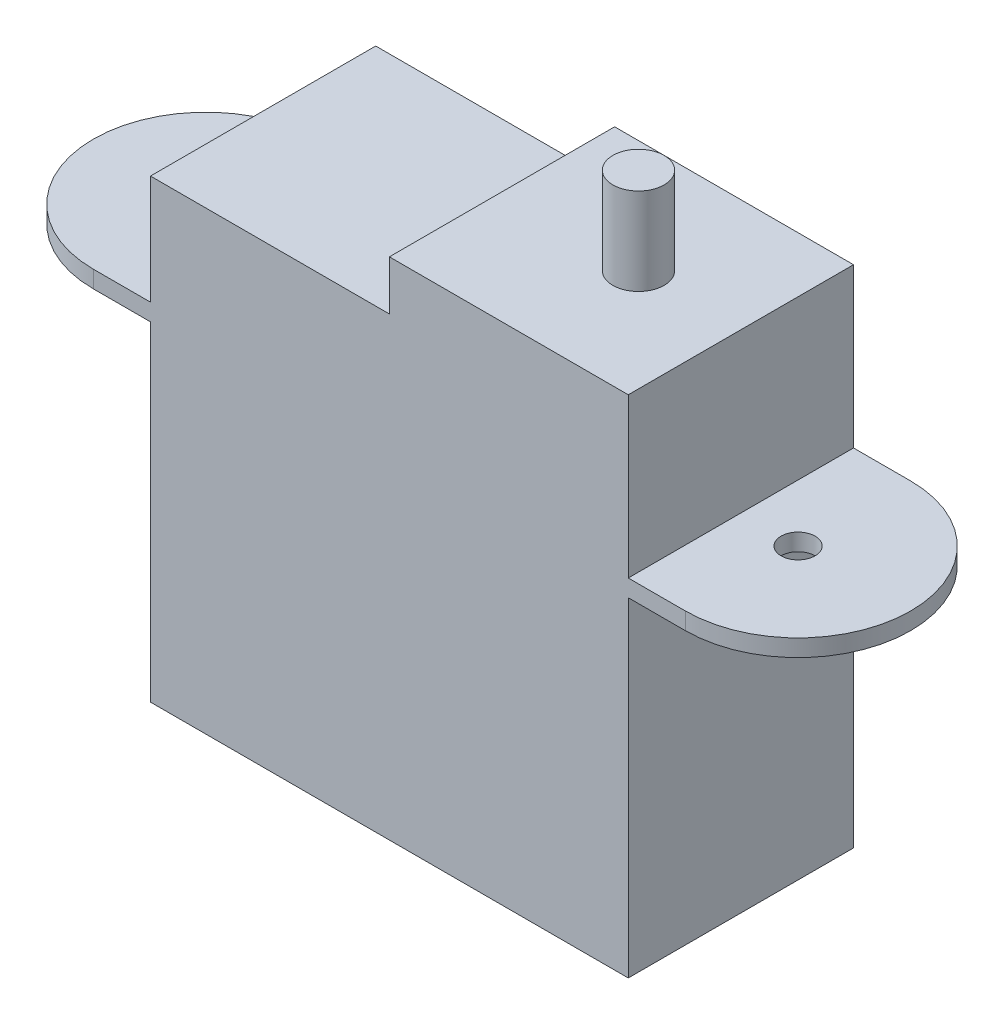
ISO-10303-21;
HEADER;
FILE_DESCRIPTION(('STEP AP214'),'2;1');
FILE_NAME('part.step','',(''),(''),'','','');
FILE_SCHEMA(('AUTOMOTIVE_DESIGN { 1 0 10303 214 1 1 1 1 }'));
ENDSEC;
DATA;
#1=APPLICATION_CONTEXT('core data for automotive mechanical design processes');
#2=APPLICATION_PROTOCOL_DEFINITION('international standard','automotive_design',2000,#1);
#3=PRODUCT_CONTEXT('',#1,'mechanical');
#4=PRODUCT('Part','Part','',(#3));
#5=PRODUCT_RELATED_PRODUCT_CATEGORY('part','',(#4));
#6=PRODUCT_DEFINITION_FORMATION('','',#4);
#7=PRODUCT_DEFINITION_CONTEXT('part definition',#1,'design');
#8=PRODUCT_DEFINITION('design','',#6,#7);
#9=PRODUCT_DEFINITION_SHAPE('','',#8);
#10=(LENGTH_UNIT() NAMED_UNIT(*) SI_UNIT(.MILLI.,.METRE.));
#11=(NAMED_UNIT(*) PLANE_ANGLE_UNIT() SI_UNIT($,.RADIAN.));
#12=(NAMED_UNIT(*) SI_UNIT($,.STERADIAN.) SOLID_ANGLE_UNIT());
#13=UNCERTAINTY_MEASURE_WITH_UNIT(LENGTH_MEASURE(1.E-05),#10,'distance_accuracy_value','');
#14=(GEOMETRIC_REPRESENTATION_CONTEXT(3) GLOBAL_UNCERTAINTY_ASSIGNED_CONTEXT((#13)) GLOBAL_UNIT_ASSIGNED_CONTEXT((#10,
#11,#12)) REPRESENTATION_CONTEXT('',''));
#15=CARTESIAN_POINT('',(0.,0.,0.));
#16=DIRECTION('',(0.,0.,1.));
#17=DIRECTION('',(1.,0.,0.));
#18=AXIS2_PLACEMENT_3D('',#15,#16,#17);
#19=CARTESIAN_POINT('',(-3.35,20.3,-6.6));
#20=DIRECTION('',(0.,1.,0.));
#21=DIRECTION('',(0.,0.,1.));
#22=AXIS2_PLACEMENT_3D('',#19,#20,#21);
#23=PLANE('',#22);
#24=CARTESIAN_POINT('',(-3.35,20.3,-6.6));
#25=DIRECTION('',(0.,1.,0.));
#26=DIRECTION('',(0.,0.,1.));
#27=AXIS2_PLACEMENT_3D('',#24,#25,#26);
#28=CIRCLE('',#27,1.);
#29=CARTESIAN_POINT('',(-3.35,20.3,-5.6));
#30=VERTEX_POINT('',#29);
#31=EDGE_CURVE('E231',#30,#30,#28,.T.);
#32=ORIENTED_EDGE('',*,*,#31,.F.);
#33=EDGE_LOOP('',(#32));
#34=FACE_BOUND('',#33,.T.);
#35=DIRECTION('',(0.,0.,1.));
#36=VECTOR('',#35,1.);
#37=CARTESIAN_POINT('',(0.,20.3,0.));
#38=LINE('',#37,#36);
#39=CARTESIAN_POINT('',(0.,20.3,-13.2));
#40=VERTEX_POINT('',#39);
#41=CARTESIAN_POINT('',(0.,20.3,0.));
#42=VERTEX_POINT('',#41);
#43=EDGE_CURVE('E155',#40,#42,#38,.T.);
#44=ORIENTED_EDGE('',*,*,#43,.F.);
#45=DIRECTION('',(-1.,0.,0.));
#46=VECTOR('',#45,1.);
#47=CARTESIAN_POINT('',(-3.35,20.3,-13.2));
#48=LINE('',#47,#46);
#49=CARTESIAN_POINT('',(-3.35,20.3,-13.2));
#50=VERTEX_POINT('',#49);
#51=EDGE_CURVE('E174',#40,#50,#48,.T.);
#52=ORIENTED_EDGE('',*,*,#51,.T.);
#53=CARTESIAN_POINT('',(-3.35,20.3,-6.6));
#54=DIRECTION('',(0.,1.,0.));
#55=DIRECTION('',(0.,0.,1.));
#56=AXIS2_PLACEMENT_3D('',#53,#54,#55);
#57=CIRCLE('',#56,6.6);
#58=CARTESIAN_POINT('',(-3.35,20.3,0.));
#59=VERTEX_POINT('',#58);
#60=EDGE_CURVE('E165',#50,#59,#57,.T.);
#61=ORIENTED_EDGE('',*,*,#60,.T.);
#62=DIRECTION('',(1.,0.,0.));
#63=VECTOR('',#62,1.);
#64=CARTESIAN_POINT('',(-3.35,20.3,0.));
#65=LINE('',#64,#63);
#66=EDGE_CURVE('E170',#59,#42,#65,.T.);
#67=ORIENTED_EDGE('',*,*,#66,.T.);
#68=EDGE_LOOP('',(#44,#52,#61,#67));
#69=FACE_BOUND('',#68,.T.);
#70=ADVANCED_FACE('F35',(#34,#69),#23,.T.);
#71=CARTESIAN_POINT('',(0.,19.3,0.));
#72=DIRECTION('',(1.,0.,0.));
#73=DIRECTION('',(0.,0.,-1.));
#74=AXIS2_PLACEMENT_3D('',#71,#72,#73);
#75=PLANE('',#74);
#76=DIRECTION('',(0.,0.,1.));
#77=VECTOR('',#76,1.);
#78=CARTESIAN_POINT('',(0.,0.,0.));
#79=LINE('',#78,#77);
#80=CARTESIAN_POINT('',(0.,0.,-13.2));
#81=VERTEX_POINT('',#80);
#82=CARTESIAN_POINT('',(0.,0.,0.));
#83=VERTEX_POINT('',#82);
#84=EDGE_CURVE('E203',#81,#83,#79,.T.);
#85=ORIENTED_EDGE('',*,*,#84,.T.);
#86=DIRECTION('',(0.,-1.,0.));
#87=VECTOR('',#86,1.);
#88=CARTESIAN_POINT('',(0.,19.3,0.));
#89=LINE('',#88,#87);
#90=CARTESIAN_POINT('',(0.,19.3,0.));
#91=VERTEX_POINT('',#90);
#92=EDGE_CURVE('E227',#91,#83,#89,.T.);
#93=ORIENTED_EDGE('',*,*,#92,.F.);
#94=DIRECTION('',(0.,0.,1.));
#95=VECTOR('',#94,1.);
#96=CARTESIAN_POINT('',(0.,19.3,0.));
#97=LINE('',#96,#95);
#98=CARTESIAN_POINT('',(0.,19.3,-13.2));
#99=VERTEX_POINT('',#98);
#100=EDGE_CURVE('E204',#99,#91,#97,.T.);
#101=ORIENTED_EDGE('',*,*,#100,.F.);
#102=DIRECTION('',(0.,-1.,0.));
#103=VECTOR('',#102,1.);
#104=CARTESIAN_POINT('',(0.,19.3,-13.2));
#105=LINE('',#104,#103);
#106=EDGE_CURVE('E211',#99,#81,#105,.T.);
#107=ORIENTED_EDGE('',*,*,#106,.T.);
#108=EDGE_LOOP('',(#85,#93,#101,#107));
#109=FACE_BOUND('',#108,.T.);
#110=ADVANCED_FACE('F37',(#109),#75,.F.);
#111=CARTESIAN_POINT('',(0.,19.3,0.));
#112=DIRECTION('',(0.,0.,-1.));
#113=DIRECTION('',(-1.,0.,0.));
#114=AXIS2_PLACEMENT_3D('',#111,#112,#113);
#115=PLANE('',#114);
#116=DIRECTION('',(-1.,0.,0.));
#117=VECTOR('',#116,1.);
#118=CARTESIAN_POINT('',(0.,29.6,0.));
#119=LINE('',#118,#117);
#120=CARTESIAN_POINT('',(28.,29.6,0.));
#121=VERTEX_POINT('',#120);
#122=CARTESIAN_POINT('',(14.,29.6,0.));
#123=VERTEX_POINT('',#122);
#124=EDGE_CURVE('E183',#121,#123,#119,.T.);
#125=ORIENTED_EDGE('',*,*,#124,.T.);
#126=DIRECTION('',(0.,1.,0.));
#127=VECTOR('',#126,1.);
#128=CARTESIAN_POINT('',(14.,26.7,0.));
#129=LINE('',#128,#127);
#130=CARTESIAN_POINT('',(14.,26.7,0.));
#131=VERTEX_POINT('',#130);
#132=EDGE_CURVE('E50',#131,#123,#129,.T.);
#133=ORIENTED_EDGE('',*,*,#132,.F.);
#134=DIRECTION('',(1.,0.,0.));
#135=VECTOR('',#134,1.);
#136=CARTESIAN_POINT('',(7.,26.7,0.));
#137=LINE('',#136,#135);
#138=CARTESIAN_POINT('',(0.,26.7,0.));
#139=VERTEX_POINT('',#138);
#140=EDGE_CURVE('E141',#139,#131,#137,.T.);
#141=ORIENTED_EDGE('',*,*,#140,.F.);
#142=DIRECTION('',(0.,-1.,0.));
#143=VECTOR('',#142,1.);
#144=CARTESIAN_POINT('',(0.,90.1554518623134,0.));
#145=LINE('',#144,#143);
#146=EDGE_CURVE('E150',#139,#42,#145,.T.);
#147=ORIENTED_EDGE('',*,*,#146,.T.);
#148=ORIENTED_EDGE('',*,*,#66,.F.);
#149=DIRECTION('',(0.,-1.,0.));
#150=VECTOR('',#149,1.);
#151=CARTESIAN_POINT('',(-3.35,20.3,0.));
#152=LINE('',#151,#150);
#153=CARTESIAN_POINT('',(-3.35,19.3,0.));
#154=VERTEX_POINT('',#153);
#155=EDGE_CURVE('E200',#59,#154,#152,.T.);
#156=ORIENTED_EDGE('',*,*,#155,.T.);
#157=DIRECTION('',(1.,0.,0.));
#158=VECTOR('',#157,1.);
#159=CARTESIAN_POINT('',(-3.35,19.3,0.));
#160=LINE('',#159,#158);
#161=EDGE_CURVE('E184',#154,#91,#160,.T.);
#162=ORIENTED_EDGE('',*,*,#161,.T.);
#163=ORIENTED_EDGE('',*,*,#92,.T.);
#164=DIRECTION('',(1.,0.,0.));
#165=VECTOR('',#164,1.);
#166=CARTESIAN_POINT('',(0.,0.,0.));
#167=LINE('',#166,#165);
#168=CARTESIAN_POINT('',(28.,0.,0.));
#169=VERTEX_POINT('',#168);
#170=EDGE_CURVE('E214',#83,#169,#167,.T.);
#171=ORIENTED_EDGE('',*,*,#170,.T.);
#172=DIRECTION('',(0.,-1.,0.));
#173=VECTOR('',#172,1.);
#174=CARTESIAN_POINT('',(28.,19.3,0.));
#175=LINE('',#174,#173);
#176=CARTESIAN_POINT('',(28.,19.3,0.));
#177=VERTEX_POINT('',#176);
#178=EDGE_CURVE('E224',#177,#169,#175,.T.);
#179=ORIENTED_EDGE('',*,*,#178,.F.);
#180=CARTESIAN_POINT('',(31.35,19.3,0.));
#181=VERTEX_POINT('',#180);
#182=EDGE_CURVE('E182',#177,#181,#160,.T.);
#183=ORIENTED_EDGE('',*,*,#182,.T.);
#184=DIRECTION('',(0.,-1.,0.));
#185=VECTOR('',#184,1.);
#186=CARTESIAN_POINT('',(31.35,20.3,0.));
#187=LINE('',#186,#185);
#188=CARTESIAN_POINT('',(31.35,20.3,0.));
#189=VERTEX_POINT('',#188);
#190=EDGE_CURVE('E197',#189,#181,#187,.T.);
#191=ORIENTED_EDGE('',*,*,#190,.F.);
#192=CARTESIAN_POINT('',(28.,20.3,0.));
#193=VERTEX_POINT('',#192);
#194=EDGE_CURVE('E168',#193,#189,#65,.T.);
#195=ORIENTED_EDGE('',*,*,#194,.F.);
#196=DIRECTION('',(0.,-1.,0.));
#197=VECTOR('',#196,1.);
#198=CARTESIAN_POINT('',(28.,90.1554518623134,0.));
#199=LINE('',#198,#197);
#200=EDGE_CURVE('E157',#121,#193,#199,.T.);
#201=ORIENTED_EDGE('',*,*,#200,.F.);
#202=EDGE_LOOP('',(#125,#133,#141,#147,#148,#156,#162,#163,#171,#179,#183,#191,#195,#201));
#203=FACE_BOUND('',#202,.T.);
#204=ADVANCED_FACE('F149',(#203),#115,.F.);
#205=CARTESIAN_POINT('',(28.,19.3,0.));
#206=DIRECTION('',(-1.,0.,0.));
#207=DIRECTION('',(0.,0.,1.));
#208=AXIS2_PLACEMENT_3D('',#205,#206,#207);
#209=PLANE('',#208);
#210=DIRECTION('',(0.,0.,-1.));
#211=VECTOR('',#210,1.);
#212=CARTESIAN_POINT('',(28.,0.,0.));
#213=LINE('',#212,#211);
#214=CARTESIAN_POINT('',(28.,0.,-13.2));
#215=VERTEX_POINT('',#214);
#216=EDGE_CURVE('E216',#169,#215,#213,.T.);
#217=ORIENTED_EDGE('',*,*,#216,.T.);
#218=DIRECTION('',(0.,-1.,0.));
#219=VECTOR('',#218,1.);
#220=CARTESIAN_POINT('',(28.,19.3,-13.2));
#221=LINE('',#220,#219);
#222=CARTESIAN_POINT('',(28.,19.3,-13.2));
#223=VERTEX_POINT('',#222);
#224=EDGE_CURVE('E221',#223,#215,#221,.T.);
#225=ORIENTED_EDGE('',*,*,#224,.F.);
#226=DIRECTION('',(0.,0.,-1.));
#227=VECTOR('',#226,1.);
#228=CARTESIAN_POINT('',(28.,19.3,0.));
#229=LINE('',#228,#227);
#230=EDGE_CURVE('E207',#177,#223,#229,.T.);
#231=ORIENTED_EDGE('',*,*,#230,.F.);
#232=ORIENTED_EDGE('',*,*,#178,.T.);
#233=EDGE_LOOP('',(#217,#225,#231,#232));
#234=FACE_BOUND('',#233,.T.);
#235=ADVANCED_FACE('F282',(#234),#209,.F.);
#236=CARTESIAN_POINT('',(0.,19.3,-13.2));
#237=DIRECTION('',(0.,0.,1.));
#238=DIRECTION('',(1.,0.,0.));
#239=AXIS2_PLACEMENT_3D('',#236,#237,#238);
#240=PLANE('',#239);
#241=DIRECTION('',(1.,0.,0.));
#242=VECTOR('',#241,1.);
#243=CARTESIAN_POINT('',(0.,26.7,-13.2));
#244=LINE('',#243,#242);
#245=CARTESIAN_POINT('',(0.,26.7,-13.2));
#246=VERTEX_POINT('',#245);
#247=CARTESIAN_POINT('',(14.,26.7,-13.2));
#248=VERTEX_POINT('',#247);
#249=EDGE_CURVE('E143',#246,#248,#244,.T.);
#250=ORIENTED_EDGE('',*,*,#249,.T.);
#251=DIRECTION('',(0.,1.,0.));
#252=VECTOR('',#251,1.);
#253=CARTESIAN_POINT('',(14.,19.3,-13.2));
#254=LINE('',#253,#252);
#255=CARTESIAN_POINT('',(14.,29.6,-13.2));
#256=VERTEX_POINT('',#255);
#257=EDGE_CURVE('E245',#248,#256,#254,.T.);
#258=ORIENTED_EDGE('',*,*,#257,.T.);
#259=DIRECTION('',(1.,0.,0.));
#260=VECTOR('',#259,1.);
#261=CARTESIAN_POINT('',(0.,29.6,-13.2));
#262=LINE('',#261,#260);
#263=CARTESIAN_POINT('',(28.,29.6,-13.2));
#264=VERTEX_POINT('',#263);
#265=EDGE_CURVE('E156',#256,#264,#262,.T.);
#266=ORIENTED_EDGE('',*,*,#265,.T.);
#267=DIRECTION('',(0.,-1.,0.));
#268=VECTOR('',#267,1.);
#269=CARTESIAN_POINT('',(28.,90.1554518623134,-13.2));
#270=LINE('',#269,#268);
#271=CARTESIAN_POINT('',(28.,20.3,-13.2));
#272=VERTEX_POINT('',#271);
#273=EDGE_CURVE('E161',#264,#272,#270,.T.);
#274=ORIENTED_EDGE('',*,*,#273,.T.);
#275=CARTESIAN_POINT('',(31.35,20.3,-13.2));
#276=VERTEX_POINT('',#275);
#277=EDGE_CURVE('E175',#276,#272,#48,.T.);
#278=ORIENTED_EDGE('',*,*,#277,.F.);
#279=DIRECTION('',(0.,-1.,0.));
#280=VECTOR('',#279,1.);
#281=CARTESIAN_POINT('',(31.35,20.3,-13.2));
#282=LINE('',#281,#280);
#283=CARTESIAN_POINT('',(31.35,19.3,-13.2));
#284=VERTEX_POINT('',#283);
#285=EDGE_CURVE('E194',#276,#284,#282,.T.);
#286=ORIENTED_EDGE('',*,*,#285,.T.);
#287=DIRECTION('',(-1.,0.,0.));
#288=VECTOR('',#287,1.);
#289=CARTESIAN_POINT('',(-3.35,19.3,-13.2));
#290=LINE('',#289,#288);
#291=EDGE_CURVE('E169',#284,#223,#290,.T.);
#292=ORIENTED_EDGE('',*,*,#291,.T.);
#293=ORIENTED_EDGE('',*,*,#224,.T.);
#294=DIRECTION('',(-1.,0.,0.));
#295=VECTOR('',#294,1.);
#296=CARTESIAN_POINT('',(0.,0.,-13.2));
#297=LINE('',#296,#295);
#298=EDGE_CURVE('E208',#215,#81,#297,.T.);
#299=ORIENTED_EDGE('',*,*,#298,.T.);
#300=ORIENTED_EDGE('',*,*,#106,.F.);
#301=CARTESIAN_POINT('',(-3.35,19.3,-13.2));
#302=VERTEX_POINT('',#301);
#303=EDGE_CURVE('E189',#99,#302,#290,.T.);
#304=ORIENTED_EDGE('',*,*,#303,.T.);
#305=DIRECTION('',(0.,-1.,0.));
#306=VECTOR('',#305,1.);
#307=CARTESIAN_POINT('',(-3.35,20.3,-13.2));
#308=LINE('',#307,#306);
#309=EDGE_CURVE('E178',#50,#302,#308,.T.);
#310=ORIENTED_EDGE('',*,*,#309,.F.);
#311=ORIENTED_EDGE('',*,*,#51,.F.);
#312=DIRECTION('',(0.,-1.,0.));
#313=VECTOR('',#312,1.);
#314=CARTESIAN_POINT('',(0.,90.1554518623134,-13.2));
#315=LINE('',#314,#313);
#316=EDGE_CURVE('E58',#246,#40,#315,.T.);
#317=ORIENTED_EDGE('',*,*,#316,.F.);
#318=EDGE_LOOP('',(#250,#258,#266,#274,#278,#286,#292,#293,#299,#300,#304,#310,#311,#317));
#319=FACE_BOUND('',#318,.T.);
#320=ADVANCED_FACE('F260',(#319),#240,.F.);
#321=CARTESIAN_POINT('',(0.,0.,0.));
#322=DIRECTION('',(0.,-1.,0.));
#323=DIRECTION('',(0.,0.,-1.));
#324=AXIS2_PLACEMENT_3D('',#321,#322,#323);
#325=PLANE('',#324);
#326=ORIENTED_EDGE('',*,*,#84,.F.);
#327=ORIENTED_EDGE('',*,*,#298,.F.);
#328=ORIENTED_EDGE('',*,*,#216,.F.);
#329=ORIENTED_EDGE('',*,*,#170,.F.);
#330=EDGE_LOOP('',(#326,#327,#328,#329));
#331=FACE_BOUND('',#330,.T.);
#332=ADVANCED_FACE('F287',(#331),#325,.T.);
#333=CARTESIAN_POINT('',(-3.35,19.3,-6.6));
#334=DIRECTION('',(0.,1.,0.));
#335=DIRECTION('',(0.,0.,1.));
#336=AXIS2_PLACEMENT_3D('',#333,#334,#335);
#337=PLANE('',#336);
#338=CARTESIAN_POINT('',(-3.35,19.3,-6.6));
#339=DIRECTION('',(0.,1.,0.));
#340=DIRECTION('',(0.,0.,1.));
#341=AXIS2_PLACEMENT_3D('',#338,#339,#340);
#342=CIRCLE('',#341,1.);
#343=CARTESIAN_POINT('',(-3.35,19.3,-5.6));
#344=VERTEX_POINT('',#343);
#345=EDGE_CURVE('E152',#344,#344,#342,.T.);
#346=ORIENTED_EDGE('',*,*,#345,.T.);
#347=EDGE_LOOP('',(#346));
#348=FACE_BOUND('',#347,.T.);
#349=ORIENTED_EDGE('',*,*,#303,.F.);
#350=ORIENTED_EDGE('',*,*,#100,.T.);
#351=ORIENTED_EDGE('',*,*,#161,.F.);
#352=CARTESIAN_POINT('',(-3.35,19.3,-6.6));
#353=DIRECTION('',(0.,1.,0.));
#354=DIRECTION('',(0.,0.,1.));
#355=AXIS2_PLACEMENT_3D('',#352,#353,#354);
#356=CIRCLE('',#355,6.6);
#357=EDGE_CURVE('E179',#302,#154,#356,.T.);
#358=ORIENTED_EDGE('',*,*,#357,.F.);
#359=EDGE_LOOP('',(#349,#350,#351,#358));
#360=FACE_BOUND('',#359,.T.);
#361=ADVANCED_FACE('F299',(#348,#360),#337,.F.);
#362=CARTESIAN_POINT('',(31.35,19.3,-6.6));
#363=DIRECTION('',(0.,1.,0.));
#364=DIRECTION('',(0.,0.,1.));
#365=AXIS2_PLACEMENT_3D('',#362,#363,#364);
#366=CIRCLE('',#365,0.999999999999998);
#367=CARTESIAN_POINT('',(31.35,19.3,-5.6));
#368=VERTEX_POINT('',#367);
#369=EDGE_CURVE('E235',#368,#368,#366,.T.);
#370=ORIENTED_EDGE('',*,*,#369,.T.);
#371=EDGE_LOOP('',(#370));
#372=FACE_BOUND('',#371,.T.);
#373=ORIENTED_EDGE('',*,*,#182,.F.);
#374=ORIENTED_EDGE('',*,*,#230,.T.);
#375=ORIENTED_EDGE('',*,*,#291,.F.);
#376=CARTESIAN_POINT('',(31.35,19.3,-6.6));
#377=DIRECTION('',(0.,1.,0.));
#378=DIRECTION('',(0.,0.,1.));
#379=AXIS2_PLACEMENT_3D('',#376,#377,#378);
#380=CIRCLE('',#379,6.6);
#381=EDGE_CURVE('E187',#181,#284,#380,.T.);
#382=ORIENTED_EDGE('',*,*,#381,.F.);
#383=EDGE_LOOP('',(#373,#374,#375,#382));
#384=FACE_BOUND('',#383,.T.);
#385=ADVANCED_FACE('F279',(#372,#384),#337,.F.);
#386=CARTESIAN_POINT('',(-3.35,20.3,-6.6));
#387=DIRECTION('',(0.,-1.,0.));
#388=DIRECTION('',(0.,0.,-1.));
#389=AXIS2_PLACEMENT_3D('',#386,#387,#388);
#390=CYLINDRICAL_SURFACE('',#389,6.6);
#391=ORIENTED_EDGE('',*,*,#357,.T.);
#392=ORIENTED_EDGE('',*,*,#155,.F.);
#393=ORIENTED_EDGE('',*,*,#60,.F.);
#394=ORIENTED_EDGE('',*,*,#309,.T.);
#395=EDGE_LOOP('',(#391,#392,#393,#394));
#396=FACE_BOUND('',#395,.T.);
#397=ADVANCED_FACE('F297',(#396),#390,.T.);
#398=CARTESIAN_POINT('',(31.35,20.3,-6.6));
#399=DIRECTION('',(0.,-1.,0.));
#400=DIRECTION('',(0.,0.,-1.));
#401=AXIS2_PLACEMENT_3D('',#398,#399,#400);
#402=CYLINDRICAL_SURFACE('',#401,6.6);
#403=ORIENTED_EDGE('',*,*,#381,.T.);
#404=ORIENTED_EDGE('',*,*,#285,.F.);
#405=CARTESIAN_POINT('',(31.35,20.3,-6.6));
#406=DIRECTION('',(0.,1.,0.));
#407=DIRECTION('',(0.,0.,1.));
#408=AXIS2_PLACEMENT_3D('',#405,#406,#407);
#409=CIRCLE('',#408,6.6);
#410=EDGE_CURVE('E172',#189,#276,#409,.T.);
#411=ORIENTED_EDGE('',*,*,#410,.F.);
#412=ORIENTED_EDGE('',*,*,#190,.T.);
#413=EDGE_LOOP('',(#403,#404,#411,#412));
#414=FACE_BOUND('',#413,.T.);
#415=ADVANCED_FACE('F276',(#414),#402,.T.);
#416=CARTESIAN_POINT('',(31.35,20.3,-6.6));
#417=DIRECTION('',(0.,1.,0.));
#418=DIRECTION('',(0.,0.,1.));
#419=AXIS2_PLACEMENT_3D('',#416,#417,#418);
#420=CIRCLE('',#419,0.999999999999998);
#421=CARTESIAN_POINT('',(31.35,20.3,-5.6));
#422=VERTEX_POINT('',#421);
#423=EDGE_CURVE('E240',#422,#422,#420,.T.);
#424=ORIENTED_EDGE('',*,*,#423,.F.);
#425=EDGE_LOOP('',(#424));
#426=FACE_BOUND('',#425,.T.);
#427=DIRECTION('',(0.,0.,-1.));
#428=VECTOR('',#427,1.);
#429=CARTESIAN_POINT('',(28.,20.3,0.));
#430=LINE('',#429,#428);
#431=EDGE_CURVE('E254',#193,#272,#430,.T.);
#432=ORIENTED_EDGE('',*,*,#431,.F.);
#433=ORIENTED_EDGE('',*,*,#194,.T.);
#434=ORIENTED_EDGE('',*,*,#410,.T.);
#435=ORIENTED_EDGE('',*,*,#277,.T.);
#436=EDGE_LOOP('',(#432,#433,#434,#435));
#437=FACE_BOUND('',#436,.T.);
#438=ADVANCED_FACE('F266',(#426,#437),#23,.T.);
#439=CARTESIAN_POINT('',(28.,90.1554518623134,0.));
#440=DIRECTION('',(-1.,0.,0.));
#441=DIRECTION('',(0.,0.,1.));
#442=AXIS2_PLACEMENT_3D('',#439,#440,#441);
#443=PLANE('',#442);
#444=ORIENTED_EDGE('',*,*,#431,.T.);
#445=ORIENTED_EDGE('',*,*,#273,.F.);
#446=DIRECTION('',(0.,0.,1.));
#447=VECTOR('',#446,1.);
#448=CARTESIAN_POINT('',(28.,29.6,0.));
#449=LINE('',#448,#447);
#450=EDGE_CURVE('E159',#264,#121,#449,.T.);
#451=ORIENTED_EDGE('',*,*,#450,.T.);
#452=ORIENTED_EDGE('',*,*,#200,.T.);
#453=EDGE_LOOP('',(#444,#445,#451,#452));
#454=FACE_BOUND('',#453,.T.);
#455=ADVANCED_FACE('F270',(#454),#443,.F.);
#456=CARTESIAN_POINT('',(0.,90.1554518623134,0.));
#457=DIRECTION('',(1.,0.,0.));
#458=DIRECTION('',(0.,0.,-1.));
#459=AXIS2_PLACEMENT_3D('',#456,#457,#458);
#460=PLANE('',#459);
#461=ORIENTED_EDGE('',*,*,#146,.F.);
#462=DIRECTION('',(0.,0.,1.));
#463=VECTOR('',#462,1.);
#464=CARTESIAN_POINT('',(0.,26.7,-20.2));
#465=LINE('',#464,#463);
#466=EDGE_CURVE('E137',#246,#139,#465,.T.);
#467=ORIENTED_EDGE('',*,*,#466,.F.);
#468=ORIENTED_EDGE('',*,*,#316,.T.);
#469=ORIENTED_EDGE('',*,*,#43,.T.);
#470=EDGE_LOOP('',(#461,#467,#468,#469));
#471=FACE_BOUND('',#470,.T.);
#472=ADVANCED_FACE('F154',(#471),#460,.F.);
#473=CARTESIAN_POINT('',(0.,29.6,0.));
#474=DIRECTION('',(0.,-1.,0.));
#475=DIRECTION('',(0.,0.,-1.));
#476=AXIS2_PLACEMENT_3D('',#473,#474,#475);
#477=PLANE('',#476);
#478=CARTESIAN_POINT('',(22.,29.6,-6.6));
#479=DIRECTION('',(0.,-1.,0.));
#480=DIRECTION('',(0.,0.,-1.));
#481=AXIS2_PLACEMENT_3D('',#478,#479,#480);
#482=CIRCLE('',#481,1.5);
#483=CARTESIAN_POINT('',(22.,29.6,-8.1));
#484=VERTEX_POINT('',#483);
#485=EDGE_CURVE('E12',#484,#484,#482,.F.);
#486=ORIENTED_EDGE('',*,*,#485,.F.);
#487=EDGE_LOOP('',(#486));
#488=FACE_BOUND('',#487,.T.);
#489=ORIENTED_EDGE('',*,*,#265,.F.);
#490=DIRECTION('',(0.,0.,1.));
#491=VECTOR('',#490,1.);
#492=CARTESIAN_POINT('',(14.,29.6,0.));
#493=LINE('',#492,#491);
#494=EDGE_CURVE('E43',#256,#123,#493,.T.);
#495=ORIENTED_EDGE('',*,*,#494,.T.);
#496=ORIENTED_EDGE('',*,*,#124,.F.);
#497=ORIENTED_EDGE('',*,*,#450,.F.);
#498=EDGE_LOOP('',(#489,#495,#496,#497));
#499=FACE_BOUND('',#498,.T.);
#500=ADVANCED_FACE('F302',(#488,#499),#477,.F.);
#501=CARTESIAN_POINT('',(7.,26.7,-20.2));
#502=DIRECTION('',(0.,-1.,0.));
#503=DIRECTION('',(1.,0.,0.));
#504=AXIS2_PLACEMENT_3D('',#501,#502,#503);
#505=PLANE('',#504);
#506=ORIENTED_EDGE('',*,*,#466,.T.);
#507=ORIENTED_EDGE('',*,*,#140,.T.);
#508=DIRECTION('',(0.,0.,1.));
#509=VECTOR('',#508,1.);
#510=CARTESIAN_POINT('',(14.,26.7,-20.2));
#511=LINE('',#510,#509);
#512=EDGE_CURVE('E145',#248,#131,#511,.T.);
#513=ORIENTED_EDGE('',*,*,#512,.F.);
#514=ORIENTED_EDGE('',*,*,#249,.F.);
#515=EDGE_LOOP('',(#506,#507,#513,#514));
#516=FACE_BOUND('',#515,.T.);
#517=ADVANCED_FACE('F139',(#516),#505,.F.);
#518=CARTESIAN_POINT('',(14.,26.7,-20.2));
#519=DIRECTION('',(1.,0.,0.));
#520=DIRECTION('',(0.,0.,-1.));
#521=AXIS2_PLACEMENT_3D('',#518,#519,#520);
#522=PLANE('',#521);
#523=ORIENTED_EDGE('',*,*,#512,.T.);
#524=ORIENTED_EDGE('',*,*,#132,.T.);
#525=ORIENTED_EDGE('',*,*,#494,.F.);
#526=ORIENTED_EDGE('',*,*,#257,.F.);
#527=EDGE_LOOP('',(#523,#524,#525,#526));
#528=FACE_BOUND('',#527,.T.);
#529=ADVANCED_FACE('F303',(#528),#522,.F.);
#530=CARTESIAN_POINT('',(-3.35,0.,-6.6));
#531=DIRECTION('',(0.,1.,0.));
#532=DIRECTION('',(0.,0.,1.));
#533=AXIS2_PLACEMENT_3D('',#530,#531,#532);
#534=CYLINDRICAL_SURFACE('',#533,1.);
#535=ORIENTED_EDGE('',*,*,#31,.T.);
#536=EDGE_LOOP('',(#535));
#537=FACE_BOUND('',#536,.T.);
#538=ORIENTED_EDGE('',*,*,#345,.F.);
#539=EDGE_LOOP('',(#538));
#540=FACE_BOUND('',#539,.T.);
#541=ADVANCED_FACE('F305',(#537,#540),#534,.F.);
#542=CARTESIAN_POINT('',(31.35,0.,-6.6));
#543=DIRECTION('',(0.,1.,0.));
#544=DIRECTION('',(0.,0.,1.));
#545=AXIS2_PLACEMENT_3D('',#542,#543,#544);
#546=CYLINDRICAL_SURFACE('',#545,0.999999999999998);
#547=ORIENTED_EDGE('',*,*,#423,.T.);
#548=EDGE_LOOP('',(#547));
#549=FACE_BOUND('',#548,.T.);
#550=ORIENTED_EDGE('',*,*,#369,.F.);
#551=EDGE_LOOP('',(#550));
#552=FACE_BOUND('',#551,.T.);
#553=ADVANCED_FACE('F311',(#549,#552),#546,.F.);
#554=CARTESIAN_POINT('',(22.,73.6426406871193,-6.6));
#555=DIRECTION('',(0.,-1.,0.));
#556=DIRECTION('',(0.,0.,-1.));
#557=AXIS2_PLACEMENT_3D('',#554,#555,#556);
#558=CYLINDRICAL_SURFACE('',#557,1.5);
#559=CARTESIAN_POINT('',(22.,34.7,-6.6));
#560=DIRECTION('',(0.,-1.,0.));
#561=DIRECTION('',(0.,0.,-1.));
#562=AXIS2_PLACEMENT_3D('',#559,#560,#561);
#563=CIRCLE('',#562,1.5);
#564=CARTESIAN_POINT('',(22.,34.7,-8.1));
#565=VERTEX_POINT('',#564);
#566=EDGE_CURVE('E333',#565,#565,#563,.T.);
#567=ORIENTED_EDGE('',*,*,#566,.T.);
#568=EDGE_LOOP('',(#567));
#569=FACE_BOUND('',#568,.T.);
#570=ORIENTED_EDGE('',*,*,#485,.T.);
#571=EDGE_LOOP('',(#570));
#572=FACE_BOUND('',#571,.T.);
#573=ADVANCED_FACE('F338',(#569,#572),#558,.T.);
#574=CARTESIAN_POINT('',(0.,34.7,0.));
#575=DIRECTION('',(0.,-1.,0.));
#576=DIRECTION('',(0.,0.,-1.));
#577=AXIS2_PLACEMENT_3D('',#574,#575,#576);
#578=PLANE('',#577);
#579=ORIENTED_EDGE('',*,*,#566,.F.);
#580=EDGE_LOOP('',(#579));
#581=FACE_BOUND('',#580,.T.);
#582=ADVANCED_FACE('F341',(#581),#578,.F.);
#583=CLOSED_SHELL('',(#70,#110,#204,#235,#320,#332,#361,#385,#397,#415,#438,#455,#472,#500,#517,
#529,#541,#553,#573,#582));
#584=MANIFOLD_SOLID_BREP('B2',#583);
#585=ADVANCED_BREP_SHAPE_REPRESENTATION('',(#18,#584),#14);
#586=SHAPE_DEFINITION_REPRESENTATION(#9,#585);
ENDSEC;
END-ISO-10303-21;
